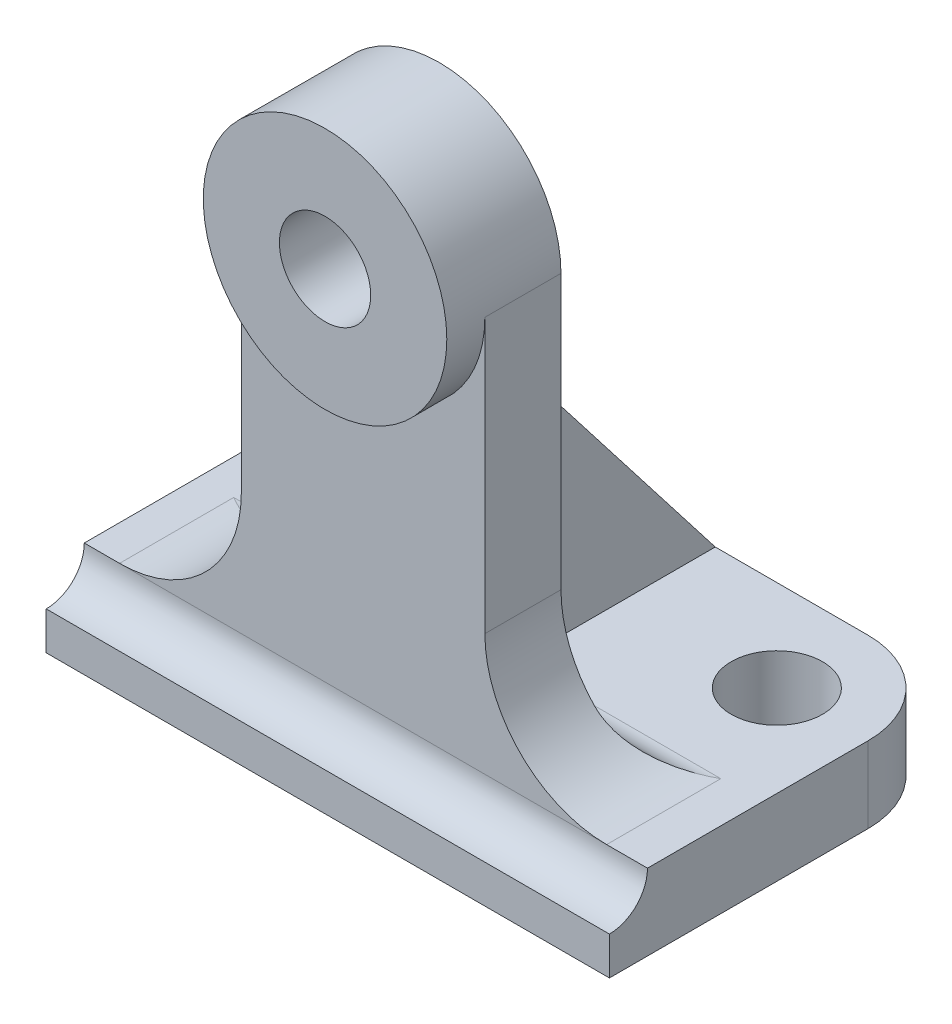
ISO-10303-21;
HEADER;
FILE_DESCRIPTION(('STEP AP214'),'2;1');
FILE_NAME('part.step','',(''),(''),'','','');
FILE_SCHEMA(('AUTOMOTIVE_DESIGN { 1 0 10303 214 1 1 1 1 }'));
ENDSEC;
DATA;
#1=APPLICATION_CONTEXT('core data for automotive mechanical design processes');
#2=APPLICATION_PROTOCOL_DEFINITION('international standard','automotive_design',2000,#1);
#3=PRODUCT_CONTEXT('',#1,'mechanical');
#4=PRODUCT('Part','Part','',(#3));
#5=PRODUCT_RELATED_PRODUCT_CATEGORY('part','',(#4));
#6=PRODUCT_DEFINITION_FORMATION('','',#4);
#7=PRODUCT_DEFINITION_CONTEXT('part definition',#1,'design');
#8=PRODUCT_DEFINITION('design','',#6,#7);
#9=PRODUCT_DEFINITION_SHAPE('','',#8);
#10=(LENGTH_UNIT() NAMED_UNIT(*) SI_UNIT(.MILLI.,.METRE.));
#11=(NAMED_UNIT(*) PLANE_ANGLE_UNIT() SI_UNIT($,.RADIAN.));
#12=(NAMED_UNIT(*) SI_UNIT($,.STERADIAN.) SOLID_ANGLE_UNIT());
#13=UNCERTAINTY_MEASURE_WITH_UNIT(LENGTH_MEASURE(1.E-05),#10,'distance_accuracy_value','');
#14=(GEOMETRIC_REPRESENTATION_CONTEXT(3) GLOBAL_UNCERTAINTY_ASSIGNED_CONTEXT((#13)) GLOBAL_UNIT_ASSIGNED_CONTEXT((#10,
#11,#12)) REPRESENTATION_CONTEXT('',''));
#15=CARTESIAN_POINT('',(0.,0.,0.));
#16=DIRECTION('',(0.,0.,1.));
#17=DIRECTION('',(1.,0.,0.));
#18=AXIS2_PLACEMENT_3D('',#15,#16,#17);
#19=CARTESIAN_POINT('',(-42.3665631211225,-25.8058271644575,-10.));
#20=DIRECTION('',(0.,0.,1.));
#21=DIRECTION('',(1.,0.,0.));
#22=AXIS2_PLACEMENT_3D('',#19,#20,#21);
#23=PLANE('',#22);
#24=CARTESIAN_POINT('',(-10.3665631211225,10.1941728355425,-10.));
#25=DIRECTION('',(0.,0.,1.));
#26=DIRECTION('',(1.,0.,0.));
#27=AXIS2_PLACEMENT_3D('',#24,#25,#26);
#28=CIRCLE('',#27,6.);
#29=CARTESIAN_POINT('',(-4.36656312112248,10.1941728355425,-10.));
#30=VERTEX_POINT('',#29);
#31=EDGE_CURVE('E218',#30,#30,#28,.T.);
#32=ORIENTED_EDGE('',*,*,#31,.T.);
#33=EDGE_LOOP('',(#32));
#34=FACE_BOUND('',#33,.T.);
#35=CARTESIAN_POINT('',(21.6334368788775,-25.8058271644575,-10.));
#36=DIRECTION('',(0.,0.,-1.));
#37=DIRECTION('',(-1.,0.,0.));
#38=AXIS2_PLACEMENT_3D('',#35,#36,#37);
#39=CIRCLE('',#38,16.);
#40=CARTESIAN_POINT('',(10.0144868402553,-36.8058271644575,-10.));
#41=VERTEX_POINT('',#40);
#42=CARTESIAN_POINT('',(5.63343687887752,-25.8058271644574,-10.));
#43=VERTEX_POINT('',#42);
#44=EDGE_CURVE('E226',#41,#43,#39,.T.);
#45=ORIENTED_EDGE('',*,*,#44,.F.);
#46=DIRECTION('',(1.,0.,0.));
#47=VECTOR('',#46,1.);
#48=CARTESIAN_POINT('',(-42.3665631211225,-36.8058271644575,-10.));
#49=LINE('',#48,#47);
#50=CARTESIAN_POINT('',(-5.09176911318022,-36.8058271644575,-10.));
#51=VERTEX_POINT('',#50);
#52=EDGE_CURVE('E300',#41,#51,#49,.F.);
#53=ORIENTED_EDGE('',*,*,#52,.T.);
#54=DIRECTION('',(0.,-1.,0.));
#55=VECTOR('',#54,1.);
#56=CARTESIAN_POINT('',(-5.09176911318022,-1.80582716445754,-10.));
#57=LINE('',#56,#55);
#58=CARTESIAN_POINT('',(-5.09176911318022,-1.80582716445754,-10.));
#59=VERTEX_POINT('',#58);
#60=EDGE_CURVE('E392',#59,#51,#57,.T.);
#61=ORIENTED_EDGE('',*,*,#60,.F.);
#62=DIRECTION('',(1.,0.,0.));
#63=VECTOR('',#62,1.);
#64=CARTESIAN_POINT('',(-15.0917691131802,-1.80582716445754,-10.));
#65=LINE('',#64,#63);
#66=CARTESIAN_POINT('',(-15.0917691131802,-1.80582716445754,-10.));
#67=VERTEX_POINT('',#66);
#68=EDGE_CURVE('E168',#67,#59,#65,.T.);
#69=ORIENTED_EDGE('',*,*,#68,.F.);
#70=DIRECTION('',(0.,-1.,0.));
#71=VECTOR('',#70,1.);
#72=CARTESIAN_POINT('',(-15.0917691131802,-1.80582716445754,-10.));
#73=LINE('',#72,#71);
#74=CARTESIAN_POINT('',(-15.0917691131802,-36.8058271644575,-10.));
#75=VERTEX_POINT('',#74);
#76=EDGE_CURVE('E197',#67,#75,#73,.T.);
#77=ORIENTED_EDGE('',*,*,#76,.T.);
#78=DIRECTION('',(1.,0.,0.));
#79=VECTOR('',#78,1.);
#80=CARTESIAN_POINT('',(-42.3665631211225,-36.8058271644575,-10.));
#81=LINE('',#80,#79);
#82=CARTESIAN_POINT('',(-30.7476130825002,-36.8058271644575,-10.));
#83=VERTEX_POINT('',#82);
#84=EDGE_CURVE('E365',#75,#83,#81,.F.);
#85=ORIENTED_EDGE('',*,*,#84,.T.);
#86=CARTESIAN_POINT('',(-42.3665631211225,-25.8058271644575,-10.));
#87=DIRECTION('',(0.,0.,-1.));
#88=DIRECTION('',(1.,0.,0.));
#89=AXIS2_PLACEMENT_3D('',#86,#87,#88);
#90=CIRCLE('',#89,16.);
#91=CARTESIAN_POINT('',(-26.3665631211225,-25.8058271644574,-10.));
#92=VERTEX_POINT('',#91);
#93=EDGE_CURVE('E232',#92,#83,#90,.T.);
#94=ORIENTED_EDGE('',*,*,#93,.F.);
#95=DIRECTION('',(0.,-1.,0.));
#96=VECTOR('',#95,1.);
#97=CARTESIAN_POINT('',(-26.3665631211225,-25.8058271644574,-10.));
#98=LINE('',#97,#96);
#99=CARTESIAN_POINT('',(-26.3665631211225,10.1941728355425,-10.));
#100=VERTEX_POINT('',#99);
#101=EDGE_CURVE('E229',#100,#92,#98,.T.);
#102=ORIENTED_EDGE('',*,*,#101,.F.);
#103=CARTESIAN_POINT('',(-10.3665631211225,10.1941728355425,-10.));
#104=DIRECTION('',(0.,0.,1.));
#105=DIRECTION('',(1.,0.,0.));
#106=AXIS2_PLACEMENT_3D('',#103,#104,#105);
#107=CIRCLE('',#106,16.);
#108=CARTESIAN_POINT('',(5.63343687887752,10.1941728355425,-10.));
#109=VERTEX_POINT('',#108);
#110=EDGE_CURVE('E225',#109,#100,#107,.T.);
#111=ORIENTED_EDGE('',*,*,#110,.F.);
#112=DIRECTION('',(0.,1.,0.));
#113=VECTOR('',#112,1.);
#114=CARTESIAN_POINT('',(5.63343687887752,-25.8058271644574,-10.));
#115=LINE('',#114,#113);
#116=EDGE_CURVE('E222',#43,#109,#115,.T.);
#117=ORIENTED_EDGE('',*,*,#116,.F.);
#118=EDGE_LOOP('',(#45,#53,#61,#69,#77,#85,#94,#102,#111,#117));
#119=FACE_BOUND('',#118,.T.);
#120=ADVANCED_FACE('F33',(#34,#119),#23,.F.);
#121=CARTESIAN_POINT('',(-47.0009704231051,-41.8058271644575,-10.));
#122=DIRECTION('',(0.,1.,0.));
#123=DIRECTION('',(0.,0.,1.));
#124=AXIS2_PLACEMENT_3D('',#121,#122,#123);
#125=PLANE('',#124);
#126=CARTESIAN_POINT('',(-35.0009704231051,-41.8058271644575,-29.));
#127=DIRECTION('',(0.,1.,0.));
#128=DIRECTION('',(0.,0.,1.));
#129=AXIS2_PLACEMENT_3D('',#126,#127,#128);
#130=CIRCLE('',#129,6.);
#131=CARTESIAN_POINT('',(-35.0009704231051,-41.8058271644575,-23.));
#132=VERTEX_POINT('',#131);
#133=EDGE_CURVE('E466',#132,#132,#130,.T.);
#134=ORIENTED_EDGE('',*,*,#133,.F.);
#135=EDGE_LOOP('',(#134));
#136=FACE_BOUND('',#135,.T.);
#137=DIRECTION('',(1.,0.,0.));
#138=VECTOR('',#137,1.);
#139=CARTESIAN_POINT('',(26.9990295768949,-41.8058271644575,-41.));
#140=LINE('',#139,#138);
#141=CARTESIAN_POINT('',(-35.0009704231051,-41.8058271644575,-41.));
#142=VERTEX_POINT('',#141);
#143=CARTESIAN_POINT('',(-15.0917691131802,-41.8058271644575,-41.));
#144=VERTEX_POINT('',#143);
#145=EDGE_CURVE('E188',#142,#144,#140,.T.);
#146=ORIENTED_EDGE('',*,*,#145,.F.);
#147=CARTESIAN_POINT('',(-35.0009704231051,-41.8058271644575,-29.));
#148=DIRECTION('',(0.,1.,0.));
#149=DIRECTION('',(0.,0.,1.));
#150=AXIS2_PLACEMENT_3D('',#147,#148,#149);
#151=CIRCLE('',#150,12.);
#152=CARTESIAN_POINT('',(-47.0009704231051,-41.8058271644575,-29.));
#153=VERTEX_POINT('',#152);
#154=EDGE_CURVE('E55',#142,#153,#151,.T.);
#155=ORIENTED_EDGE('',*,*,#154,.T.);
#156=DIRECTION('',(0.,0.,1.));
#157=VECTOR('',#156,1.);
#158=CARTESIAN_POINT('',(-47.0009704231051,-41.8058271644575,-10.));
#159=LINE('',#158,#157);
#160=CARTESIAN_POINT('',(-47.0009704231051,-41.8058271644575,0.));
#161=VERTEX_POINT('',#160);
#162=EDGE_CURVE('E246',#153,#161,#159,.T.);
#163=ORIENTED_EDGE('',*,*,#162,.T.);
#164=DIRECTION('',(-1.,0.,0.));
#165=VECTOR('',#164,1.);
#166=CARTESIAN_POINT('',(-47.0009704231051,-41.8058271644575,0.));
#167=LINE('',#166,#165);
#168=CARTESIAN_POINT('',(-42.3665631211226,-41.8058271644575,0.));
#169=VERTEX_POINT('',#168);
#170=EDGE_CURVE('E242',#169,#161,#167,.T.);
#171=ORIENTED_EDGE('',*,*,#170,.F.);
#172=DIRECTION('',(0.,0.,1.));
#173=VECTOR('',#172,1.);
#174=CARTESIAN_POINT('',(-42.3665631211226,-41.8058271644575,-10.));
#175=LINE('',#174,#173);
#176=CARTESIAN_POINT('',(-42.3665631211226,-41.8058271644575,-15.));
#177=VERTEX_POINT('',#176);
#178=EDGE_CURVE('E249',#177,#169,#175,.T.);
#179=ORIENTED_EDGE('',*,*,#178,.F.);
#180=DIRECTION('',(1.,0.,0.));
#181=VECTOR('',#180,1.);
#182=CARTESIAN_POINT('',(-47.0009704231051,-41.8058271644575,-15.));
#183=LINE('',#182,#181);
#184=CARTESIAN_POINT('',(-15.0917691131802,-41.8058271644575,-15.));
#185=VERTEX_POINT('',#184);
#186=EDGE_CURVE('E287',#177,#185,#183,.T.);
#187=ORIENTED_EDGE('',*,*,#186,.T.);
#188=DIRECTION('',(0.,0.,1.));
#189=VECTOR('',#188,1.);
#190=CARTESIAN_POINT('',(-15.0917691131802,-41.8058271644575,-41.));
#191=LINE('',#190,#189);
#192=EDGE_CURVE('E169',#144,#185,#191,.T.);
#193=ORIENTED_EDGE('',*,*,#192,.F.);
#194=EDGE_LOOP('',(#146,#155,#163,#171,#179,#187,#193));
#195=FACE_BOUND('',#194,.T.);
#196=ADVANCED_FACE('F333',(#136,#195),#125,.T.);
#197=CARTESIAN_POINT('',(14.9990295768949,-41.8058271644575,-29.));
#198=DIRECTION('',(0.,1.,0.));
#199=DIRECTION('',(0.,0.,1.));
#200=AXIS2_PLACEMENT_3D('',#197,#198,#199);
#201=CIRCLE('',#200,6.);
#202=CARTESIAN_POINT('',(14.9990295768949,-41.8058271644575,-23.));
#203=VERTEX_POINT('',#202);
#204=EDGE_CURVE('E468',#203,#203,#201,.T.);
#205=ORIENTED_EDGE('',*,*,#204,.F.);
#206=EDGE_LOOP('',(#205));
#207=FACE_BOUND('',#206,.T.);
#208=DIRECTION('',(0.,0.,1.));
#209=VECTOR('',#208,1.);
#210=CARTESIAN_POINT('',(26.9990295768949,-41.8058271644575,-10.));
#211=LINE('',#210,#209);
#212=CARTESIAN_POINT('',(26.9990295768949,-41.8058271644575,-29.));
#213=VERTEX_POINT('',#212);
#214=CARTESIAN_POINT('',(26.9990295768949,-41.8058271644575,0.));
#215=VERTEX_POINT('',#214);
#216=EDGE_CURVE('E257',#213,#215,#211,.T.);
#217=ORIENTED_EDGE('',*,*,#216,.F.);
#218=CARTESIAN_POINT('',(14.9990295768949,-41.8058271644575,-29.));
#219=DIRECTION('',(0.,1.,0.));
#220=DIRECTION('',(0.,0.,1.));
#221=AXIS2_PLACEMENT_3D('',#218,#219,#220);
#222=CIRCLE('',#221,12.);
#223=CARTESIAN_POINT('',(14.9990295768949,-41.8058271644575,-41.));
#224=VERTEX_POINT('',#223);
#225=EDGE_CURVE('E193',#213,#224,#222,.T.);
#226=ORIENTED_EDGE('',*,*,#225,.T.);
#227=CARTESIAN_POINT('',(-5.09176911318022,-41.8058271644575,-41.));
#228=VERTEX_POINT('',#227);
#229=EDGE_CURVE('E185',#228,#224,#140,.T.);
#230=ORIENTED_EDGE('',*,*,#229,.F.);
#231=DIRECTION('',(0.,0.,-1.));
#232=VECTOR('',#231,1.);
#233=CARTESIAN_POINT('',(-5.09176911318022,-41.8058271644575,-41.));
#234=LINE('',#233,#232);
#235=CARTESIAN_POINT('',(-5.09176911318022,-41.8058271644575,-15.));
#236=VERTEX_POINT('',#235);
#237=EDGE_CURVE('E156',#236,#228,#234,.T.);
#238=ORIENTED_EDGE('',*,*,#237,.F.);
#239=DIRECTION('',(1.,0.,0.));
#240=VECTOR('',#239,1.);
#241=CARTESIAN_POINT('',(-47.0009704231051,-41.8058271644575,-15.));
#242=LINE('',#241,#240);
#243=CARTESIAN_POINT('',(21.6334368788776,-41.8058271644575,-15.));
#244=VERTEX_POINT('',#243);
#245=EDGE_CURVE('E298',#236,#244,#242,.T.);
#246=ORIENTED_EDGE('',*,*,#245,.T.);
#247=DIRECTION('',(0.,0.,1.));
#248=VECTOR('',#247,1.);
#249=CARTESIAN_POINT('',(21.6334368788776,-41.8058271644575,-10.));
#250=LINE('',#249,#248);
#251=CARTESIAN_POINT('',(21.6334368788776,-41.8058271644575,0.));
#252=VERTEX_POINT('',#251);
#253=EDGE_CURVE('E256',#244,#252,#250,.T.);
#254=ORIENTED_EDGE('',*,*,#253,.T.);
#255=DIRECTION('',(-1.,0.,0.));
#256=VECTOR('',#255,1.);
#257=CARTESIAN_POINT('',(21.6334368788776,-41.8058271644575,0.));
#258=LINE('',#257,#256);
#259=EDGE_CURVE('E221',#215,#252,#258,.T.);
#260=ORIENTED_EDGE('',*,*,#259,.F.);
#261=EDGE_LOOP('',(#217,#226,#230,#238,#246,#254,#260));
#262=FACE_BOUND('',#261,.T.);
#263=ADVANCED_FACE('F191',(#207,#262),#125,.T.);
#264=CARTESIAN_POINT('',(-42.3665631211225,-25.8058271644575,0.));
#265=DIRECTION('',(0.,0.,1.));
#266=DIRECTION('',(1.,0.,0.));
#267=AXIS2_PLACEMENT_3D('',#264,#265,#266);
#268=PLANE('',#267);
#269=CARTESIAN_POINT('',(-42.3665631211225,-25.8058271644575,0.));
#270=DIRECTION('',(0.,0.,-1.));
#271=DIRECTION('',(1.,0.,0.));
#272=AXIS2_PLACEMENT_3D('',#269,#270,#271);
#273=CIRCLE('',#272,16.);
#274=CARTESIAN_POINT('',(-26.3665631211225,-25.8058271644574,0.));
#275=VERTEX_POINT('',#274);
#276=EDGE_CURVE('E239',#275,#169,#273,.T.);
#277=ORIENTED_EDGE('',*,*,#276,.T.);
#278=DIRECTION('',(-1.,0.,0.));
#279=VECTOR('',#278,1.);
#280=CARTESIAN_POINT('',(-42.3665631211225,-41.8058271644575,0.));
#281=LINE('',#280,#279);
#282=EDGE_CURVE('E270',#169,#252,#281,.F.);
#283=ORIENTED_EDGE('',*,*,#282,.T.);
#284=CARTESIAN_POINT('',(21.6334368788775,-25.8058271644575,0.));
#285=DIRECTION('',(0.,0.,-1.));
#286=DIRECTION('',(-1.,0.,0.));
#287=AXIS2_PLACEMENT_3D('',#284,#285,#286);
#288=CIRCLE('',#287,16.);
#289=CARTESIAN_POINT('',(5.63343687887752,-25.8058271644574,0.));
#290=VERTEX_POINT('',#289);
#291=EDGE_CURVE('E235',#252,#290,#288,.T.);
#292=ORIENTED_EDGE('',*,*,#291,.T.);
#293=DIRECTION('',(0.,1.,0.));
#294=VECTOR('',#293,1.);
#295=CARTESIAN_POINT('',(5.63343687887752,-25.8058271644574,0.));
#296=LINE('',#295,#294);
#297=CARTESIAN_POINT('',(5.63343687887752,10.1941728355425,0.));
#298=VERTEX_POINT('',#297);
#299=EDGE_CURVE('E238',#290,#298,#296,.T.);
#300=ORIENTED_EDGE('',*,*,#299,.T.);
#301=CARTESIAN_POINT('',(-10.3665631211225,10.1941728355425,0.));
#302=DIRECTION('',(0.,0.,1.));
#303=DIRECTION('',(1.,0.,0.));
#304=AXIS2_PLACEMENT_3D('',#301,#302,#303);
#305=CIRCLE('',#304,16.);
#306=CARTESIAN_POINT('',(-26.3665631211225,10.1941728355425,0.));
#307=VERTEX_POINT('',#306);
#308=EDGE_CURVE('E248',#307,#298,#305,.T.);
#309=ORIENTED_EDGE('',*,*,#308,.F.);
#310=DIRECTION('',(0.,-1.,0.));
#311=VECTOR('',#310,1.);
#312=CARTESIAN_POINT('',(-26.3665631211225,-25.8058271644574,0.));
#313=LINE('',#312,#311);
#314=EDGE_CURVE('E243',#307,#275,#313,.T.);
#315=ORIENTED_EDGE('',*,*,#314,.T.);
#316=EDGE_LOOP('',(#277,#283,#292,#300,#309,#315));
#317=FACE_BOUND('',#316,.T.);
#318=ADVANCED_FACE('F347',(#317),#268,.T.);
#319=CARTESIAN_POINT('',(-47.0009704231051,-51.8058271644575,-10.));
#320=DIRECTION('',(-1.,0.,0.));
#321=DIRECTION('',(0.,0.,1.));
#322=AXIS2_PLACEMENT_3D('',#319,#320,#321);
#323=PLANE('',#322);
#324=ORIENTED_EDGE('',*,*,#162,.F.);
#325=DIRECTION('',(0.,1.,0.));
#326=VECTOR('',#325,1.);
#327=CARTESIAN_POINT('',(-47.0009704231051,-51.8058271644575,-29.));
#328=LINE('',#327,#326);
#329=CARTESIAN_POINT('',(-47.0009704231051,-51.8058271644575,-29.));
#330=VERTEX_POINT('',#329);
#331=EDGE_CURVE('E41',#153,#330,#328,.F.);
#332=ORIENTED_EDGE('',*,*,#331,.T.);
#333=DIRECTION('',(0.,0.,1.));
#334=VECTOR('',#333,1.);
#335=CARTESIAN_POINT('',(-47.0009704231051,-51.8058271644575,-10.));
#336=LINE('',#335,#334);
#337=CARTESIAN_POINT('',(-47.0009704231051,-51.8058271644575,5.));
#338=VERTEX_POINT('',#337);
#339=EDGE_CURVE('E261',#330,#338,#336,.T.);
#340=ORIENTED_EDGE('',*,*,#339,.T.);
#341=DIRECTION('',(0.,-1.,0.));
#342=VECTOR('',#341,1.);
#343=CARTESIAN_POINT('',(-47.0009704231051,-51.8058271644575,5.));
#344=LINE('',#343,#342);
#345=CARTESIAN_POINT('',(-47.0009704231051,-46.8058271644575,5.));
#346=VERTEX_POINT('',#345);
#347=EDGE_CURVE('E209',#346,#338,#344,.T.);
#348=ORIENTED_EDGE('',*,*,#347,.F.);
#349=CARTESIAN_POINT('',(-47.0009704231051,-41.8058271644575,5.));
#350=DIRECTION('',(-1.,0.,0.));
#351=DIRECTION('',(0.,0.,1.));
#352=AXIS2_PLACEMENT_3D('',#349,#350,#351);
#353=CIRCLE('',#352,5.);
#354=EDGE_CURVE('E282',#346,#161,#353,.F.);
#355=ORIENTED_EDGE('',*,*,#354,.T.);
#356=EDGE_LOOP('',(#324,#332,#340,#348,#355));
#357=FACE_BOUND('',#356,.T.);
#358=ADVANCED_FACE('F349',(#357),#323,.T.);
#359=CARTESIAN_POINT('',(-42.3665631211225,-25.8058271644575,-10.));
#360=DIRECTION('',(0.,0.,1.));
#361=DIRECTION('',(1.,0.,0.));
#362=AXIS2_PLACEMENT_3D('',#359,#360,#361);
#363=CYLINDRICAL_SURFACE('',#362,16.);
#364=ORIENTED_EDGE('',*,*,#276,.F.);
#365=DIRECTION('',(0.,0.,1.));
#366=VECTOR('',#365,1.);
#367=CARTESIAN_POINT('',(-26.3665631211225,-25.8058271644574,-10.));
#368=LINE('',#367,#366);
#369=EDGE_CURVE('E250',#92,#275,#368,.T.);
#370=ORIENTED_EDGE('',*,*,#369,.F.);
#371=ORIENTED_EDGE('',*,*,#93,.T.);
#372=CARTESIAN_POINT('',(-30.7476130825002,-36.8058271644575,-10.));
#373=CARTESIAN_POINT('',(-30.8404872507801,-36.9039305569733,-10.0000035097307));
#374=CARTESIAN_POINT('',(-30.9345854019228,-37.0008309760487,-10.0028868310953));
#375=CARTESIAN_POINT('',(-31.1250186649261,-37.1920410386072,-10.0140181578786));
#376=CARTESIAN_POINT('',(-31.2213531325947,-37.2863514115002,-10.0222646364354));
#377=CARTESIAN_POINT('',(-31.5130761136345,-37.5648223103848,-10.054415395445));
#378=CARTESIAN_POINT('',(-31.7115661436337,-37.7449257129248,-10.0857342825746));
#379=CARTESIAN_POINT('',(-32.1133771931993,-38.0916722252695,-10.1649258150141));
#380=CARTESIAN_POINT('',(-32.3166351314928,-38.2584261023814,-10.2126398246962));
#381=CARTESIAN_POINT('',(-32.7287802630451,-38.5800798260929,-10.3222965845338));
#382=CARTESIAN_POINT('',(-32.9376710291422,-38.7349718977967,-10.3842485624163));
#383=CARTESIAN_POINT('',(-33.4609145964949,-39.103764184861,-10.5527547305159));
#384=CARTESIAN_POINT('',(-33.7780033087283,-39.3105302813203,-10.6664819973748));
#385=CARTESIAN_POINT('',(-34.419820317827,-39.6979079368507,-10.9148052945669));
#386=CARTESIAN_POINT('',(-34.7445507206938,-39.8785121853867,-11.0494071363133));
#387=CARTESIAN_POINT('',(-35.4018200811894,-40.2151815795791,-11.3359250189547));
#388=CARTESIAN_POINT('',(-35.7343941968342,-40.3710930094683,-11.4879400872667));
#389=CARTESIAN_POINT('',(-36.4040258023373,-40.6577905338207,-11.8049956680228));
#390=CARTESIAN_POINT('',(-36.7410831371606,-40.7885774947143,-11.9700357310161));
#391=CARTESIAN_POINT('',(-37.5123269869098,-41.0585759277148,-12.3572357864108));
#392=CARTESIAN_POINT('',(-37.947607994021,-41.1901228783912,-12.582574457781));
#393=CARTESIAN_POINT('',(-38.8220960431439,-41.4148195437253,-13.0446953555416));
#394=CARTESIAN_POINT('',(-39.2613044840535,-41.5079549708451,-13.281481803522));
#395=CARTESIAN_POINT('',(-40.1407299763311,-41.6565037045731,-13.7615045543705));
#396=CARTESIAN_POINT('',(-40.5809398967986,-41.712030883627,-14.0047190490951));
#397=CARTESIAN_POINT('',(-41.4623114181489,-41.7863694853695,-14.4945302094278));
#398=CARTESIAN_POINT('',(-41.9034722692903,-41.80520341715,-14.7411247080429));
#399=CARTESIAN_POINT('',(-42.3518417642547,-41.8058220827944,-14.9917705117726));
#400=CARTESIAN_POINT('',(-42.3592024656471,-41.8058271620105,-14.9958852689758));
#401=CARTESIAN_POINT('',(-42.3665631211225,-41.8058271644575,-15.));
#402=B_SPLINE_CURVE_WITH_KNOTS('',3,(#372,#373,#374,#375,#376,#377,#378,#379,#380,#381,#382,
#383,#384,#385,#386,#387,#388,#389,#390,#391,#392,#393,#394,#395,#396,#397,#398,#399,#400,#401),
.UNSPECIFIED.,.F.,.F.,(4,2,2,2,2,2,2,2,2,2,2,2,2,2,4),(0.,0.405180350888886,0.810245399599443,
1.61871587829485,2.41957433302404,3.22095330079765,4.40493796727024,5.58925284486997,
6.78067269806446,7.97205145714169,9.49275211319865,11.0140178995504,12.5306566665092,
14.0463647738528,14.0716629997254),.UNSPECIFIED.);
#403=EDGE_CURVE('E359',#83,#177,#402,.T.);
#404=ORIENTED_EDGE('',*,*,#403,.T.);
#405=ORIENTED_EDGE('',*,*,#178,.T.);
#406=EDGE_LOOP('',(#364,#370,#371,#404,#405));
#407=FACE_BOUND('',#406,.T.);
#408=ADVANCED_FACE('F352',(#407),#363,.F.);
#409=CARTESIAN_POINT('',(-26.3665631211225,-25.8058271644574,-10.));
#410=DIRECTION('',(-1.,0.,0.));
#411=DIRECTION('',(0.,0.,1.));
#412=AXIS2_PLACEMENT_3D('',#409,#410,#411);
#413=PLANE('',#412);
#414=ORIENTED_EDGE('',*,*,#314,.F.);
#415=DIRECTION('',(0.,0.,1.));
#416=VECTOR('',#415,1.);
#417=CARTESIAN_POINT('',(-26.3665631211225,10.1941728355425,-10.));
#418=LINE('',#417,#416);
#419=EDGE_CURVE('E252',#100,#307,#418,.T.);
#420=ORIENTED_EDGE('',*,*,#419,.F.);
#421=ORIENTED_EDGE('',*,*,#101,.T.);
#422=ORIENTED_EDGE('',*,*,#369,.T.);
#423=EDGE_LOOP('',(#414,#420,#421,#422));
#424=FACE_BOUND('',#423,.T.);
#425=ADVANCED_FACE('F356',(#424),#413,.T.);
#426=CARTESIAN_POINT('',(-10.3665631211225,10.1941728355425,-10.));
#427=DIRECTION('',(0.,0.,1.));
#428=DIRECTION('',(1.,0.,0.));
#429=AXIS2_PLACEMENT_3D('',#426,#427,#428);
#430=CYLINDRICAL_SURFACE('',#429,16.);
#431=ORIENTED_EDGE('',*,*,#419,.T.);
#432=ORIENTED_EDGE('',*,*,#308,.T.);
#433=DIRECTION('',(0.,0.,1.));
#434=VECTOR('',#433,1.);
#435=CARTESIAN_POINT('',(5.63343687887752,10.1941728355425,-10.));
#436=LINE('',#435,#434);
#437=EDGE_CURVE('E255',#109,#298,#436,.T.);
#438=ORIENTED_EDGE('',*,*,#437,.F.);
#439=ORIENTED_EDGE('',*,*,#110,.T.);
#440=EDGE_LOOP('',(#431,#432,#438,#439));
#441=FACE_BOUND('',#440,.T.);
#442=CARTESIAN_POINT('',(-10.3665631211225,10.1941728355425,5.));
#443=DIRECTION('',(0.,0.,1.));
#444=DIRECTION('',(1.,0.,0.));
#445=AXIS2_PLACEMENT_3D('',#442,#443,#444);
#446=CIRCLE('',#445,16.);
#447=CARTESIAN_POINT('',(5.63343687887752,10.1941728355425,5.));
#448=VERTEX_POINT('',#447);
#449=EDGE_CURVE('E215',#448,#448,#446,.T.);
#450=ORIENTED_EDGE('',*,*,#449,.F.);
#451=EDGE_LOOP('',(#450));
#452=FACE_BOUND('',#451,.T.);
#453=ADVANCED_FACE('F609',(#441,#452),#430,.T.);
#454=CARTESIAN_POINT('',(5.63343687887752,-25.8058271644574,-10.));
#455=DIRECTION('',(1.,0.,0.));
#456=DIRECTION('',(0.,0.,-1.));
#457=AXIS2_PLACEMENT_3D('',#454,#455,#456);
#458=PLANE('',#457);
#459=ORIENTED_EDGE('',*,*,#299,.F.);
#460=DIRECTION('',(0.,0.,1.));
#461=VECTOR('',#460,1.);
#462=CARTESIAN_POINT('',(5.63343687887752,-25.8058271644574,-10.));
#463=LINE('',#462,#461);
#464=EDGE_CURVE('E253',#43,#290,#463,.T.);
#465=ORIENTED_EDGE('',*,*,#464,.F.);
#466=ORIENTED_EDGE('',*,*,#116,.T.);
#467=ORIENTED_EDGE('',*,*,#437,.T.);
#468=EDGE_LOOP('',(#459,#465,#466,#467));
#469=FACE_BOUND('',#468,.T.);
#470=ADVANCED_FACE('F584',(#469),#458,.T.);
#471=CARTESIAN_POINT('',(21.6334368788775,-25.8058271644575,-10.));
#472=DIRECTION('',(0.,0.,1.));
#473=DIRECTION('',(1.,0.,0.));
#474=AXIS2_PLACEMENT_3D('',#471,#472,#473);
#475=CYLINDRICAL_SURFACE('',#474,16.);
#476=ORIENTED_EDGE('',*,*,#291,.F.);
#477=ORIENTED_EDGE('',*,*,#253,.F.);
#478=CARTESIAN_POINT('',(10.0144868402553,-36.8058271644575,-10.));
#479=CARTESIAN_POINT('',(10.1073610085351,-36.9039305569733,-10.0000035097307));
#480=CARTESIAN_POINT('',(10.2014591596778,-37.0008309760487,-10.0028868310953));
#481=CARTESIAN_POINT('',(10.3918924226811,-37.1920410386072,-10.0140181578786));
#482=CARTESIAN_POINT('',(10.4882268903497,-37.2863514115002,-10.0222646364354));
#483=CARTESIAN_POINT('',(10.7799498713896,-37.5648223103848,-10.054415395445));
#484=CARTESIAN_POINT('',(10.9784399013887,-37.7449257129248,-10.0857342825746));
#485=CARTESIAN_POINT('',(11.3802509509544,-38.0916722252695,-10.1649258150141));
#486=CARTESIAN_POINT('',(11.5835088892478,-38.2584261023814,-10.2126398246962));
#487=CARTESIAN_POINT('',(11.9956540208002,-38.5800798260929,-10.3222965845338));
#488=CARTESIAN_POINT('',(12.2045447868972,-38.7349718977967,-10.3842485624163));
#489=CARTESIAN_POINT('',(12.7277883542499,-39.103764184861,-10.5527547305159));
#490=CARTESIAN_POINT('',(13.0448770664834,-39.3105302813203,-10.6664819973748));
#491=CARTESIAN_POINT('',(13.6866940755821,-39.6979079368507,-10.9148052945669));
#492=CARTESIAN_POINT('',(14.0114244784489,-39.8785121853867,-11.0494071363133));
#493=CARTESIAN_POINT('',(14.6686938389444,-40.2151815795791,-11.3359250189547));
#494=CARTESIAN_POINT('',(15.0012679545892,-40.3710930094683,-11.4879400872667));
#495=CARTESIAN_POINT('',(15.6708995600923,-40.6577905338207,-11.8049956680228));
#496=CARTESIAN_POINT('',(16.0079568949157,-40.7885774947143,-11.9700357310161));
#497=CARTESIAN_POINT('',(16.7792007446648,-41.0585759277149,-12.3572357864108));
#498=CARTESIAN_POINT('',(17.214481751776,-41.1901228783912,-12.582574457781));
#499=CARTESIAN_POINT('',(18.0889698008989,-41.4148195437253,-13.0446953555416));
#500=CARTESIAN_POINT('',(18.5281782418085,-41.5079549708451,-13.281481803522));
#501=CARTESIAN_POINT('',(19.4076037340861,-41.6565037045731,-13.7615045543705));
#502=CARTESIAN_POINT('',(19.8478136545536,-41.712030883627,-14.0047190490951));
#503=CARTESIAN_POINT('',(20.7291851759039,-41.7863694853695,-14.4945302094279));
#504=CARTESIAN_POINT('',(21.1703460270452,-41.80520341715,-14.741124708043));
#505=CARTESIAN_POINT('',(21.6187155220097,-41.8058220827944,-14.9917705117726));
#506=CARTESIAN_POINT('',(21.6260762234021,-41.8058271620105,-14.9958852689758));
#507=CARTESIAN_POINT('',(21.6334368788775,-41.8058271644575,-15.));
#508=B_SPLINE_CURVE_WITH_KNOTS('',3,(#478,#479,#480,#481,#482,#483,#484,#485,#486,#487,#488,
#489,#490,#491,#492,#493,#494,#495,#496,#497,#498,#499,#500,#501,#502,#503,#504,#505,#506,#507),
.UNSPECIFIED.,.F.,.F.,(4,2,2,2,2,2,2,2,2,2,2,2,2,2,4),(0.,0.405180350888885,0.810245399599443,
1.61871587829484,2.41957433302405,3.22095330079765,4.40493796727025,5.58925284486998,
6.78067269806446,7.97205145714168,9.49275211319864,11.0140178995504,12.5306566665092,
14.0463647738528,14.0716629997255),.UNSPECIFIED.);
#509=EDGE_CURVE('E303',#244,#41,#508,.F.);
#510=ORIENTED_EDGE('',*,*,#509,.T.);
#511=ORIENTED_EDGE('',*,*,#44,.T.);
#512=ORIENTED_EDGE('',*,*,#464,.T.);
#513=EDGE_LOOP('',(#476,#477,#510,#511,#512));
#514=FACE_BOUND('',#513,.T.);
#515=ADVANCED_FACE('F312',(#514),#475,.F.);
#516=CARTESIAN_POINT('',(26.9990295768949,-41.8058271644575,-10.));
#517=DIRECTION('',(1.,0.,0.));
#518=DIRECTION('',(0.,1.,0.));
#519=AXIS2_PLACEMENT_3D('',#516,#517,#518);
#520=PLANE('',#519);
#521=DIRECTION('',(0.,0.,1.));
#522=VECTOR('',#521,1.);
#523=CARTESIAN_POINT('',(26.9990295768949,-51.8058271644575,-10.));
#524=LINE('',#523,#522);
#525=CARTESIAN_POINT('',(26.9990295768949,-51.8058271644575,-29.));
#526=VERTEX_POINT('',#525);
#527=CARTESIAN_POINT('',(26.9990295768949,-51.8058271644575,5.));
#528=VERTEX_POINT('',#527);
#529=EDGE_CURVE('E259',#526,#528,#524,.T.);
#530=ORIENTED_EDGE('',*,*,#529,.F.);
#531=DIRECTION('',(0.,-1.,0.));
#532=VECTOR('',#531,1.);
#533=CARTESIAN_POINT('',(26.9990295768949,-41.8058271644575,-29.));
#534=LINE('',#533,#532);
#535=EDGE_CURVE('E420',#526,#213,#534,.F.);
#536=ORIENTED_EDGE('',*,*,#535,.T.);
#537=ORIENTED_EDGE('',*,*,#216,.T.);
#538=CARTESIAN_POINT('',(26.9990295768949,-41.8058271644575,5.));
#539=DIRECTION('',(1.,0.,0.));
#540=DIRECTION('',(0.,1.,0.));
#541=AXIS2_PLACEMENT_3D('',#538,#539,#540);
#542=CIRCLE('',#541,5.);
#543=CARTESIAN_POINT('',(26.9990295768949,-46.8058271644575,5.));
#544=VERTEX_POINT('',#543);
#545=EDGE_CURVE('E285',#215,#544,#542,.F.);
#546=ORIENTED_EDGE('',*,*,#545,.T.);
#547=DIRECTION('',(0.,1.,0.));
#548=VECTOR('',#547,1.);
#549=CARTESIAN_POINT('',(26.9990295768949,-46.8058271644575,5.));
#550=LINE('',#549,#548);
#551=EDGE_CURVE('E203',#528,#544,#550,.T.);
#552=ORIENTED_EDGE('',*,*,#551,.F.);
#553=EDGE_LOOP('',(#530,#536,#537,#546,#552));
#554=FACE_BOUND('',#553,.T.);
#555=ADVANCED_FACE('F409',(#554),#520,.T.);
#556=CARTESIAN_POINT('',(-47.0009704231051,-51.8058271644575,-10.));
#557=DIRECTION('',(0.,-1.,0.));
#558=DIRECTION('',(0.,0.,-1.));
#559=AXIS2_PLACEMENT_3D('',#556,#557,#558);
#560=PLANE('',#559);
#561=CARTESIAN_POINT('',(-35.0009704231051,-51.8058271644575,-29.));
#562=DIRECTION('',(0.,1.,0.));
#563=DIRECTION('',(0.,0.,1.));
#564=AXIS2_PLACEMENT_3D('',#561,#562,#563);
#565=CIRCLE('',#564,6.);
#566=CARTESIAN_POINT('',(-35.0009704231051,-51.8058271644575,-23.));
#567=VERTEX_POINT('',#566);
#568=EDGE_CURVE('E463',#567,#567,#565,.T.);
#569=ORIENTED_EDGE('',*,*,#568,.T.);
#570=EDGE_LOOP('',(#569));
#571=FACE_BOUND('',#570,.T.);
#572=CARTESIAN_POINT('',(14.9990295768949,-51.8058271644575,-29.));
#573=DIRECTION('',(0.,1.,0.));
#574=DIRECTION('',(0.,0.,1.));
#575=AXIS2_PLACEMENT_3D('',#572,#573,#574);
#576=CIRCLE('',#575,6.);
#577=CARTESIAN_POINT('',(14.9990295768949,-51.8058271644575,-23.));
#578=VERTEX_POINT('',#577);
#579=EDGE_CURVE('E471',#578,#578,#576,.T.);
#580=ORIENTED_EDGE('',*,*,#579,.T.);
#581=EDGE_LOOP('',(#580));
#582=FACE_BOUND('',#581,.T.);
#583=ORIENTED_EDGE('',*,*,#339,.F.);
#584=CARTESIAN_POINT('',(-35.0009704231051,-51.8058271644575,-29.));
#585=DIRECTION('',(0.,-1.,0.));
#586=DIRECTION('',(0.,0.,-1.));
#587=AXIS2_PLACEMENT_3D('',#584,#585,#586);
#588=CIRCLE('',#587,12.);
#589=CARTESIAN_POINT('',(-35.0009704231051,-51.8058271644575,-41.));
#590=VERTEX_POINT('',#589);
#591=EDGE_CURVE('E11',#330,#590,#588,.T.);
#592=ORIENTED_EDGE('',*,*,#591,.T.);
#593=DIRECTION('',(-1.,0.,0.));
#594=VECTOR('',#593,1.);
#595=CARTESIAN_POINT('',(26.9990295768949,-51.8058271644575,-41.));
#596=LINE('',#595,#594);
#597=CARTESIAN_POINT('',(14.9990295768949,-51.8058271644575,-41.));
#598=VERTEX_POINT('',#597);
#599=EDGE_CURVE('E194',#598,#590,#596,.T.);
#600=ORIENTED_EDGE('',*,*,#599,.F.);
#601=CARTESIAN_POINT('',(14.9990295768949,-51.8058271644575,-29.));
#602=DIRECTION('',(0.,-1.,0.));
#603=DIRECTION('',(0.,0.,-1.));
#604=AXIS2_PLACEMENT_3D('',#601,#602,#603);
#605=CIRCLE('',#604,12.);
#606=EDGE_CURVE('E418',#598,#526,#605,.T.);
#607=ORIENTED_EDGE('',*,*,#606,.T.);
#608=ORIENTED_EDGE('',*,*,#529,.T.);
#609=DIRECTION('',(1.,0.,0.));
#610=VECTOR('',#609,1.);
#611=CARTESIAN_POINT('',(26.9990295768949,-51.8058271644575,5.));
#612=LINE('',#611,#610);
#613=EDGE_CURVE('E196',#338,#528,#612,.T.);
#614=ORIENTED_EDGE('',*,*,#613,.F.);
#615=EDGE_LOOP('',(#583,#592,#600,#607,#608,#614));
#616=FACE_BOUND('',#615,.T.);
#617=ADVANCED_FACE('F415',(#571,#582,#616),#560,.T.);
#618=CARTESIAN_POINT('',(-10.3665631211225,10.1941728355425,-10.));
#619=DIRECTION('',(0.,0.,1.));
#620=DIRECTION('',(1.,0.,0.));
#621=AXIS2_PLACEMENT_3D('',#618,#619,#620);
#622=CYLINDRICAL_SURFACE('',#621,6.);
#623=ORIENTED_EDGE('',*,*,#31,.F.);
#624=EDGE_LOOP('',(#623));
#625=FACE_BOUND('',#624,.T.);
#626=CARTESIAN_POINT('',(-10.3665631211225,10.1941728355425,5.));
#627=DIRECTION('',(0.,0.,1.));
#628=DIRECTION('',(1.,0.,0.));
#629=AXIS2_PLACEMENT_3D('',#626,#627,#628);
#630=CIRCLE('',#629,6.);
#631=CARTESIAN_POINT('',(-4.36656312112248,10.1941728355425,5.));
#632=VERTEX_POINT('',#631);
#633=EDGE_CURVE('E212',#632,#632,#630,.T.);
#634=ORIENTED_EDGE('',*,*,#633,.T.);
#635=EDGE_LOOP('',(#634));
#636=FACE_BOUND('',#635,.T.);
#637=ADVANCED_FACE('F345',(#625,#636),#622,.F.);
#638=CARTESIAN_POINT('',(-10.3665631211225,10.1941728355425,5.));
#639=DIRECTION('',(0.,0.,1.));
#640=DIRECTION('',(1.,0.,0.));
#641=AXIS2_PLACEMENT_3D('',#638,#639,#640);
#642=PLANE('',#641);
#643=ORIENTED_EDGE('',*,*,#449,.T.);
#644=EDGE_LOOP('',(#643));
#645=FACE_BOUND('',#644,.T.);
#646=ORIENTED_EDGE('',*,*,#633,.F.);
#647=EDGE_LOOP('',(#646));
#648=FACE_BOUND('',#647,.T.);
#649=ADVANCED_FACE('F439',(#645,#648),#642,.T.);
#650=CARTESIAN_POINT('',(-47.0009704231051,-51.8058271644575,5.));
#651=DIRECTION('',(0.,0.,-1.));
#652=DIRECTION('',(-1.,0.,0.));
#653=AXIS2_PLACEMENT_3D('',#650,#651,#652);
#654=PLANE('',#653);
#655=ORIENTED_EDGE('',*,*,#613,.T.);
#656=ORIENTED_EDGE('',*,*,#551,.T.);
#657=DIRECTION('',(-1.,0.,0.));
#658=VECTOR('',#657,1.);
#659=CARTESIAN_POINT('',(-47.0009704231051,-46.8058271644575,5.));
#660=LINE('',#659,#658);
#661=EDGE_CURVE('E206',#544,#346,#660,.T.);
#662=ORIENTED_EDGE('',*,*,#661,.T.);
#663=ORIENTED_EDGE('',*,*,#347,.T.);
#664=EDGE_LOOP('',(#655,#656,#662,#663));
#665=FACE_BOUND('',#664,.T.);
#666=ADVANCED_FACE('F411',(#665),#654,.F.);
#667=CARTESIAN_POINT('',(-47.0009704231051,-41.8058271644575,5.));
#668=DIRECTION('',(-1.,0.,0.));
#669=DIRECTION('',(0.,-1.,0.));
#670=AXIS2_PLACEMENT_3D('',#667,#668,#669);
#671=CYLINDRICAL_SURFACE('',#670,5.);
#672=ORIENTED_EDGE('',*,*,#282,.F.);
#673=ORIENTED_EDGE('',*,*,#170,.T.);
#674=ORIENTED_EDGE('',*,*,#354,.F.);
#675=ORIENTED_EDGE('',*,*,#661,.F.);
#676=ORIENTED_EDGE('',*,*,#545,.F.);
#677=ORIENTED_EDGE('',*,*,#259,.T.);
#678=EDGE_LOOP('',(#672,#673,#674,#675,#676,#677));
#679=FACE_BOUND('',#678,.T.);
#680=ADVANCED_FACE('F404',(#679),#671,.F.);
#681=CARTESIAN_POINT('',(26.9990295768949,-51.8058271644575,-41.));
#682=DIRECTION('',(0.,0.,-1.));
#683=DIRECTION('',(-1.,0.,0.));
#684=AXIS2_PLACEMENT_3D('',#681,#682,#683);
#685=PLANE('',#684);
#686=ORIENTED_EDGE('',*,*,#599,.T.);
#687=DIRECTION('',(0.,1.,0.));
#688=VECTOR('',#687,1.);
#689=CARTESIAN_POINT('',(-35.0009704231051,-51.8058271644575,-41.));
#690=LINE('',#689,#688);
#691=EDGE_CURVE('E422',#590,#142,#690,.T.);
#692=ORIENTED_EDGE('',*,*,#691,.T.);
#693=ORIENTED_EDGE('',*,*,#145,.T.);
#694=DIRECTION('',(-1.,0.,0.));
#695=VECTOR('',#694,1.);
#696=CARTESIAN_POINT('',(-5.09176911318022,-41.8058271644575,-41.));
#697=LINE('',#696,#695);
#698=EDGE_CURVE('E175',#228,#144,#697,.T.);
#699=ORIENTED_EDGE('',*,*,#698,.F.);
#700=ORIENTED_EDGE('',*,*,#229,.T.);
#701=DIRECTION('',(0.,-1.,0.));
#702=VECTOR('',#701,1.);
#703=CARTESIAN_POINT('',(14.9990295768949,-51.8058271644575,-41.));
#704=LINE('',#703,#702);
#705=EDGE_CURVE('E310',#224,#598,#704,.T.);
#706=ORIENTED_EDGE('',*,*,#705,.T.);
#707=EDGE_LOOP('',(#686,#692,#693,#699,#700,#706));
#708=FACE_BOUND('',#707,.T.);
#709=ADVANCED_FACE('F183',(#708),#685,.T.);
#710=CARTESIAN_POINT('',(-15.0917691131802,-1.80582716445754,-41.));
#711=DIRECTION('',(1.,0.,0.));
#712=DIRECTION('',(0.,0.,-1.));
#713=AXIS2_PLACEMENT_3D('',#710,#711,#712);
#714=PLANE('',#713);
#715=ORIENTED_EDGE('',*,*,#192,.T.);
#716=CARTESIAN_POINT('',(-15.0917691131802,-36.8058271644575,-15.));
#717=DIRECTION('',(1.,0.,0.));
#718=DIRECTION('',(0.,0.,-1.));
#719=AXIS2_PLACEMENT_3D('',#716,#717,#718);
#720=CIRCLE('',#719,5.);
#721=EDGE_CURVE('E367',#185,#75,#720,.F.);
#722=ORIENTED_EDGE('',*,*,#721,.T.);
#723=ORIENTED_EDGE('',*,*,#76,.F.);
#724=DIRECTION('',(0.,0.790415052175244,0.612571665435814));
#725=VECTOR('',#724,1.);
#726=CARTESIAN_POINT('',(-15.0917691131802,-41.8058271644575,-41.));
#727=LINE('',#726,#725);
#728=EDGE_CURVE('E178',#144,#67,#727,.T.);
#729=ORIENTED_EDGE('',*,*,#728,.F.);
#730=EDGE_LOOP('',(#715,#722,#723,#729));
#731=FACE_BOUND('',#730,.T.);
#732=ADVANCED_FACE('F386',(#731),#714,.F.);
#733=CARTESIAN_POINT('',(-5.09176911318022,-1.80582716445754,-41.));
#734=DIRECTION('',(-1.,0.,0.));
#735=DIRECTION('',(0.,0.,1.));
#736=AXIS2_PLACEMENT_3D('',#733,#734,#735);
#737=PLANE('',#736);
#738=ORIENTED_EDGE('',*,*,#60,.T.);
#739=CARTESIAN_POINT('',(-5.09176911318022,-36.8058271644575,-15.));
#740=DIRECTION('',(-1.,0.,0.));
#741=DIRECTION('',(0.,0.,1.));
#742=AXIS2_PLACEMENT_3D('',#739,#740,#741);
#743=CIRCLE('',#742,5.);
#744=EDGE_CURVE('E163',#51,#236,#743,.F.);
#745=ORIENTED_EDGE('',*,*,#744,.T.);
#746=ORIENTED_EDGE('',*,*,#237,.T.);
#747=DIRECTION('',(0.,0.790415052175244,0.612571665435814));
#748=VECTOR('',#747,1.);
#749=CARTESIAN_POINT('',(-5.09176911318022,-41.8058271644575,-41.));
#750=LINE('',#749,#748);
#751=EDGE_CURVE('E160',#228,#59,#750,.T.);
#752=ORIENTED_EDGE('',*,*,#751,.T.);
#753=EDGE_LOOP('',(#738,#745,#746,#752));
#754=FACE_BOUND('',#753,.T.);
#755=ADVANCED_FACE('F159',(#754),#737,.F.);
#756=CARTESIAN_POINT('',(-5.09176911318022,-41.8058271644575,-41.));
#757=DIRECTION('',(0.,-0.612571665435814,0.790415052175244));
#758=DIRECTION('',(0.,-0.790415052175244,-0.612571665435814));
#759=AXIS2_PLACEMENT_3D('',#756,#757,#758);
#760=PLANE('',#759);
#761=ORIENTED_EDGE('',*,*,#728,.T.);
#762=ORIENTED_EDGE('',*,*,#68,.T.);
#763=ORIENTED_EDGE('',*,*,#751,.F.);
#764=ORIENTED_EDGE('',*,*,#698,.T.);
#765=EDGE_LOOP('',(#761,#762,#763,#764));
#766=FACE_BOUND('',#765,.T.);
#767=ADVANCED_FACE('F174',(#766),#760,.F.);
#768=CARTESIAN_POINT('',(-47.0009704231051,-36.8058271644575,-15.));
#769=DIRECTION('',(1.,0.,0.));
#770=DIRECTION('',(0.,0.,-1.));
#771=AXIS2_PLACEMENT_3D('',#768,#769,#770);
#772=CYLINDRICAL_SURFACE('',#771,5.);
#773=ORIENTED_EDGE('',*,*,#403,.F.);
#774=ORIENTED_EDGE('',*,*,#84,.F.);
#775=ORIENTED_EDGE('',*,*,#721,.F.);
#776=ORIENTED_EDGE('',*,*,#186,.F.);
#777=EDGE_LOOP('',(#773,#774,#775,#776));
#778=FACE_BOUND('',#777,.T.);
#779=ADVANCED_FACE('F321',(#778),#772,.F.);
#780=CARTESIAN_POINT('',(-47.0009704231051,-36.8058271644575,-15.));
#781=DIRECTION('',(1.,0.,0.));
#782=DIRECTION('',(0.,0.,-1.));
#783=AXIS2_PLACEMENT_3D('',#780,#781,#782);
#784=CYLINDRICAL_SURFACE('',#783,5.);
#785=ORIENTED_EDGE('',*,*,#744,.F.);
#786=ORIENTED_EDGE('',*,*,#52,.F.);
#787=ORIENTED_EDGE('',*,*,#509,.F.);
#788=ORIENTED_EDGE('',*,*,#245,.F.);
#789=EDGE_LOOP('',(#785,#786,#787,#788));
#790=FACE_BOUND('',#789,.T.);
#791=ADVANCED_FACE('F316',(#790),#784,.F.);
#792=CARTESIAN_POINT('',(14.9990295768949,-51.8058271644575,-29.));
#793=DIRECTION('',(0.,-1.,0.));
#794=DIRECTION('',(1.,0.,0.));
#795=AXIS2_PLACEMENT_3D('',#792,#793,#794);
#796=CYLINDRICAL_SURFACE('',#795,12.);
#797=ORIENTED_EDGE('',*,*,#225,.F.);
#798=ORIENTED_EDGE('',*,*,#535,.F.);
#799=ORIENTED_EDGE('',*,*,#606,.F.);
#800=ORIENTED_EDGE('',*,*,#705,.F.);
#801=EDGE_LOOP('',(#797,#798,#799,#800));
#802=FACE_BOUND('',#801,.T.);
#803=ADVANCED_FACE('F320',(#802),#796,.T.);
#804=CARTESIAN_POINT('',(-35.0009704231051,-51.8058271644575,-29.));
#805=DIRECTION('',(0.,1.,0.));
#806=DIRECTION('',(0.,0.,1.));
#807=AXIS2_PLACEMENT_3D('',#804,#805,#806);
#808=CYLINDRICAL_SURFACE('',#807,12.);
#809=ORIENTED_EDGE('',*,*,#591,.F.);
#810=ORIENTED_EDGE('',*,*,#331,.F.);
#811=ORIENTED_EDGE('',*,*,#154,.F.);
#812=ORIENTED_EDGE('',*,*,#691,.F.);
#813=EDGE_LOOP('',(#809,#810,#811,#812));
#814=FACE_BOUND('',#813,.T.);
#815=ADVANCED_FACE('F35',(#814),#808,.T.);
#816=CARTESIAN_POINT('',(14.9990295768949,-51.8058271644575,-29.));
#817=DIRECTION('',(0.,1.,0.));
#818=DIRECTION('',(0.,0.,1.));
#819=AXIS2_PLACEMENT_3D('',#816,#817,#818);
#820=CYLINDRICAL_SURFACE('',#819,6.);
#821=ORIENTED_EDGE('',*,*,#579,.F.);
#822=EDGE_LOOP('',(#821));
#823=FACE_BOUND('',#822,.T.);
#824=ORIENTED_EDGE('',*,*,#204,.T.);
#825=EDGE_LOOP('',(#824));
#826=FACE_BOUND('',#825,.T.);
#827=ADVANCED_FACE('F330',(#823,#826),#820,.F.);
#828=CARTESIAN_POINT('',(-35.0009704231051,-51.8058271644575,-29.));
#829=DIRECTION('',(0.,1.,0.));
#830=DIRECTION('',(0.,0.,1.));
#831=AXIS2_PLACEMENT_3D('',#828,#829,#830);
#832=CYLINDRICAL_SURFACE('',#831,6.);
#833=ORIENTED_EDGE('',*,*,#568,.F.);
#834=EDGE_LOOP('',(#833));
#835=FACE_BOUND('',#834,.T.);
#836=ORIENTED_EDGE('',*,*,#133,.T.);
#837=EDGE_LOOP('',(#836));
#838=FACE_BOUND('',#837,.T.);
#839=ADVANCED_FACE('F454',(#835,#838),#832,.F.);
#840=CLOSED_SHELL('',(#120,#196,#263,#318,#358,#408,#425,#453,#470,#515,#555,#617,#637,#649,
#666,#680,#709,#732,#755,#767,#779,#791,#803,#815,#827,#839));
#841=MANIFOLD_SOLID_BREP('B2',#840);
#842=ADVANCED_BREP_SHAPE_REPRESENTATION('',(#18,#841),#14);
#843=SHAPE_DEFINITION_REPRESENTATION(#9,#842);
ENDSEC;
END-ISO-10303-21;
